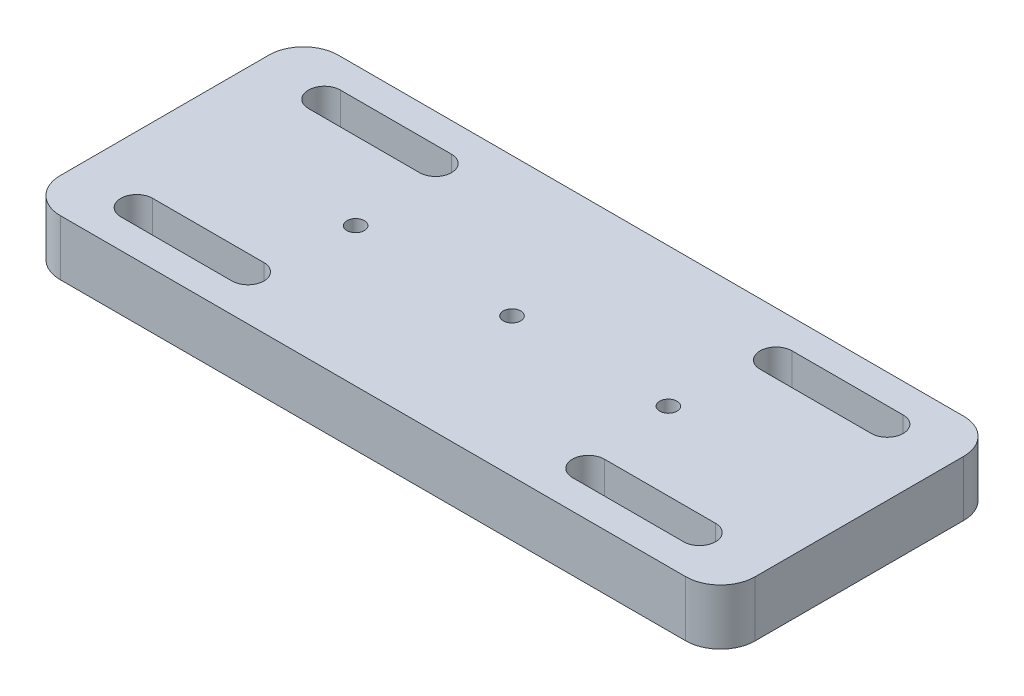
ISO-10303-21;
HEADER;
FILE_DESCRIPTION(('STEP AP214'),'2;1');
FILE_NAME('part.step','',(''),(''),'','','');
FILE_SCHEMA(('AUTOMOTIVE_DESIGN { 1 0 10303 214 1 1 1 1 }'));
ENDSEC;
DATA;
#1=APPLICATION_CONTEXT('core data for automotive mechanical design processes');
#2=APPLICATION_PROTOCOL_DEFINITION('international standard','automotive_design',2000,#1);
#3=PRODUCT_CONTEXT('',#1,'mechanical');
#4=PRODUCT('Part','Part','',(#3));
#5=PRODUCT_RELATED_PRODUCT_CATEGORY('part','',(#4));
#6=PRODUCT_DEFINITION_FORMATION('','',#4);
#7=PRODUCT_DEFINITION_CONTEXT('part definition',#1,'design');
#8=PRODUCT_DEFINITION('design','',#6,#7);
#9=PRODUCT_DEFINITION_SHAPE('','',#8);
#10=(LENGTH_UNIT() NAMED_UNIT(*) SI_UNIT(.MILLI.,.METRE.));
#11=(NAMED_UNIT(*) PLANE_ANGLE_UNIT() SI_UNIT($,.RADIAN.));
#12=(NAMED_UNIT(*) SI_UNIT($,.STERADIAN.) SOLID_ANGLE_UNIT());
#13=UNCERTAINTY_MEASURE_WITH_UNIT(LENGTH_MEASURE(1.E-05),#10,'distance_accuracy_value','');
#14=(GEOMETRIC_REPRESENTATION_CONTEXT(3) GLOBAL_UNCERTAINTY_ASSIGNED_CONTEXT((#13)) GLOBAL_UNIT_ASSIGNED_CONTEXT((#10,
#11,#12)) REPRESENTATION_CONTEXT('',''));
#15=CARTESIAN_POINT('',(0.,0.,0.));
#16=DIRECTION('',(0.,0.,1.));
#17=DIRECTION('',(1.,0.,0.));
#18=AXIS2_PLACEMENT_3D('',#15,#16,#17);
#19=CARTESIAN_POINT('',(0.,8.,0.));
#20=DIRECTION('',(0.,-1.,0.));
#21=DIRECTION('',(0.,0.,-1.));
#22=AXIS2_PLACEMENT_3D('',#19,#20,#21);
#23=PLANE('',#22);
#24=CARTESIAN_POINT('',(-22.5,8.,0.));
#25=DIRECTION('',(0.,1.,0.));
#26=DIRECTION('',(0.,0.,1.));
#27=AXIS2_PLACEMENT_3D('',#24,#25,#26);
#28=CIRCLE('',#27,1.25);
#29=CARTESIAN_POINT('',(-22.5,8.,1.25));
#30=VERTEX_POINT('',#29);
#31=EDGE_CURVE('E430',#30,#30,#28,.T.);
#32=ORIENTED_EDGE('',*,*,#31,.F.);
#33=EDGE_LOOP('',(#32));
#34=FACE_BOUND('',#33,.T.);
#35=CARTESIAN_POINT('',(22.5,8.,0.));
#36=DIRECTION('',(0.,1.,0.));
#37=DIRECTION('',(0.,0.,1.));
#38=AXIS2_PLACEMENT_3D('',#35,#36,#37);
#39=CIRCLE('',#38,1.25);
#40=CARTESIAN_POINT('',(22.5,8.,1.25));
#41=VERTEX_POINT('',#40);
#42=EDGE_CURVE('E425',#41,#41,#39,.T.);
#43=ORIENTED_EDGE('',*,*,#42,.F.);
#44=EDGE_LOOP('',(#43));
#45=FACE_BOUND('',#44,.T.);
#46=CARTESIAN_POINT('',(0.,8.,0.));
#47=DIRECTION('',(0.,1.,0.));
#48=DIRECTION('',(0.,0.,1.));
#49=AXIS2_PLACEMENT_3D('',#46,#47,#48);
#50=CIRCLE('',#49,1.25);
#51=CARTESIAN_POINT('',(0.,8.,1.25));
#52=VERTEX_POINT('',#51);
#53=EDGE_CURVE('E424',#52,#52,#50,.T.);
#54=ORIENTED_EDGE('',*,*,#53,.F.);
#55=EDGE_LOOP('',(#54));
#56=FACE_BOUND('',#55,.T.);
#57=CARTESIAN_POINT('',(40.5,8.,-13.5));
#58=DIRECTION('',(0.,1.,0.));
#59=DIRECTION('',(0.,0.,-1.));
#60=AXIS2_PLACEMENT_3D('',#57,#58,#59);
#61=CIRCLE('',#60,2.3);
#62=CARTESIAN_POINT('',(40.5,8.,-11.2));
#63=VERTEX_POINT('',#62);
#64=CARTESIAN_POINT('',(40.5,8.,-15.8));
#65=VERTEX_POINT('',#64);
#66=EDGE_CURVE('E263',#63,#65,#61,.T.);
#67=ORIENTED_EDGE('',*,*,#66,.F.);
#68=DIRECTION('',(1.,0.,0.));
#69=VECTOR('',#68,1.);
#70=CARTESIAN_POINT('',(40.5,8.,-11.2));
#71=LINE('',#70,#69);
#72=CARTESIAN_POINT('',(24.5,8.,-11.2));
#73=VERTEX_POINT('',#72);
#74=EDGE_CURVE('E274',#73,#63,#71,.T.);
#75=ORIENTED_EDGE('',*,*,#74,.F.);
#76=CARTESIAN_POINT('',(24.5,8.,-13.5));
#77=DIRECTION('',(0.,1.,0.));
#78=DIRECTION('',(0.,0.,-1.));
#79=AXIS2_PLACEMENT_3D('',#76,#77,#78);
#80=CIRCLE('',#79,2.3);
#81=CARTESIAN_POINT('',(24.5,8.,-15.8));
#82=VERTEX_POINT('',#81);
#83=EDGE_CURVE('E270',#82,#73,#80,.T.);
#84=ORIENTED_EDGE('',*,*,#83,.F.);
#85=DIRECTION('',(-1.,0.,0.));
#86=VECTOR('',#85,1.);
#87=CARTESIAN_POINT('',(40.5,8.,-15.8));
#88=LINE('',#87,#86);
#89=EDGE_CURVE('E266',#65,#82,#88,.T.);
#90=ORIENTED_EDGE('',*,*,#89,.F.);
#91=EDGE_LOOP('',(#67,#75,#84,#90));
#92=FACE_BOUND('',#91,.T.);
#93=CARTESIAN_POINT('',(-40.5,8.,-13.5));
#94=DIRECTION('',(0.,1.,0.));
#95=DIRECTION('',(0.,0.,1.));
#96=AXIS2_PLACEMENT_3D('',#93,#94,#95);
#97=CIRCLE('',#96,2.3);
#98=CARTESIAN_POINT('',(-40.5,8.,-15.8));
#99=VERTEX_POINT('',#98);
#100=CARTESIAN_POINT('',(-40.5,8.,-11.2));
#101=VERTEX_POINT('',#100);
#102=EDGE_CURVE('E348',#99,#101,#97,.T.);
#103=ORIENTED_EDGE('',*,*,#102,.F.);
#104=DIRECTION('',(-1.,0.,0.));
#105=VECTOR('',#104,1.);
#106=CARTESIAN_POINT('',(-40.5,8.,-15.8));
#107=LINE('',#106,#105);
#108=CARTESIAN_POINT('',(-24.5,8.,-15.8));
#109=VERTEX_POINT('',#108);
#110=EDGE_CURVE('E359',#109,#99,#107,.T.);
#111=ORIENTED_EDGE('',*,*,#110,.F.);
#112=CARTESIAN_POINT('',(-24.5,8.,-13.5));
#113=DIRECTION('',(0.,1.,0.));
#114=DIRECTION('',(0.,0.,1.));
#115=AXIS2_PLACEMENT_3D('',#112,#113,#114);
#116=CIRCLE('',#115,2.3);
#117=CARTESIAN_POINT('',(-24.5,8.,-11.2));
#118=VERTEX_POINT('',#117);
#119=EDGE_CURVE('E355',#118,#109,#116,.T.);
#120=ORIENTED_EDGE('',*,*,#119,.F.);
#121=DIRECTION('',(1.,0.,0.));
#122=VECTOR('',#121,1.);
#123=CARTESIAN_POINT('',(-40.5,8.,-11.2));
#124=LINE('',#123,#122);
#125=EDGE_CURVE('E351',#101,#118,#124,.T.);
#126=ORIENTED_EDGE('',*,*,#125,.F.);
#127=EDGE_LOOP('',(#103,#111,#120,#126));
#128=FACE_BOUND('',#127,.T.);
#129=DIRECTION('',(1.,0.,0.));
#130=VECTOR('',#129,1.);
#131=CARTESIAN_POINT('',(-50.,8.,20.));
#132=LINE('',#131,#130);
#133=CARTESIAN_POINT('',(-45.,8.,20.));
#134=VERTEX_POINT('',#133);
#135=CARTESIAN_POINT('',(45.,8.,20.));
#136=VERTEX_POINT('',#135);
#137=EDGE_CURVE('E402',#134,#136,#132,.T.);
#138=ORIENTED_EDGE('',*,*,#137,.T.);
#139=CARTESIAN_POINT('',(45.,8.,15.));
#140=DIRECTION('',(0.,-1.,0.));
#141=DIRECTION('',(0.,0.,-1.));
#142=AXIS2_PLACEMENT_3D('',#139,#140,#141);
#143=CIRCLE('',#142,5.);
#144=CARTESIAN_POINT('',(50.,8.,15.));
#145=VERTEX_POINT('',#144);
#146=EDGE_CURVE('E463',#136,#145,#143,.F.);
#147=ORIENTED_EDGE('',*,*,#146,.T.);
#148=DIRECTION('',(0.,0.,-1.));
#149=VECTOR('',#148,1.);
#150=CARTESIAN_POINT('',(50.,8.,20.));
#151=LINE('',#150,#149);
#152=CARTESIAN_POINT('',(50.,8.,-15.));
#153=VERTEX_POINT('',#152);
#154=EDGE_CURVE('E391',#145,#153,#151,.T.);
#155=ORIENTED_EDGE('',*,*,#154,.T.);
#156=CARTESIAN_POINT('',(45.,8.,-15.));
#157=DIRECTION('',(0.,-1.,0.));
#158=DIRECTION('',(0.,0.,-1.));
#159=AXIS2_PLACEMENT_3D('',#156,#157,#158);
#160=CIRCLE('',#159,5.);
#161=CARTESIAN_POINT('',(45.,8.,-20.));
#162=VERTEX_POINT('',#161);
#163=EDGE_CURVE('E458',#153,#162,#160,.F.);
#164=ORIENTED_EDGE('',*,*,#163,.T.);
#165=DIRECTION('',(-1.,0.,0.));
#166=VECTOR('',#165,1.);
#167=CARTESIAN_POINT('',(-50.,8.,-20.));
#168=LINE('',#167,#166);
#169=CARTESIAN_POINT('',(-45.,8.,-20.));
#170=VERTEX_POINT('',#169);
#171=EDGE_CURVE('E395',#162,#170,#168,.T.);
#172=ORIENTED_EDGE('',*,*,#171,.T.);
#173=CARTESIAN_POINT('',(-45.,8.,-15.));
#174=DIRECTION('',(0.,-1.,0.));
#175=DIRECTION('',(0.,0.,-1.));
#176=AXIS2_PLACEMENT_3D('',#173,#174,#175);
#177=CIRCLE('',#176,5.);
#178=CARTESIAN_POINT('',(-50.,8.,-15.));
#179=VERTEX_POINT('',#178);
#180=EDGE_CURVE('E65',#170,#179,#177,.F.);
#181=ORIENTED_EDGE('',*,*,#180,.T.);
#182=DIRECTION('',(0.,0.,1.));
#183=VECTOR('',#182,1.);
#184=CARTESIAN_POINT('',(-50.,8.,20.));
#185=LINE('',#184,#183);
#186=CARTESIAN_POINT('',(-50.,8.,15.));
#187=VERTEX_POINT('',#186);
#188=EDGE_CURVE('E399',#179,#187,#185,.T.);
#189=ORIENTED_EDGE('',*,*,#188,.T.);
#190=CARTESIAN_POINT('',(-45.,8.,15.));
#191=DIRECTION('',(0.,-1.,0.));
#192=DIRECTION('',(0.,0.,-1.));
#193=AXIS2_PLACEMENT_3D('',#190,#191,#192);
#194=CIRCLE('',#193,5.);
#195=EDGE_CURVE('E455',#187,#134,#194,.F.);
#196=ORIENTED_EDGE('',*,*,#195,.T.);
#197=EDGE_LOOP('',(#138,#147,#155,#164,#172,#181,#189,#196));
#198=FACE_BOUND('',#197,.T.);
#199=CARTESIAN_POINT('',(-40.5,8.,13.5));
#200=DIRECTION('',(0.,1.,0.));
#201=DIRECTION('',(0.,0.,1.));
#202=AXIS2_PLACEMENT_3D('',#199,#200,#201);
#203=CIRCLE('',#202,2.3);
#204=CARTESIAN_POINT('',(-40.5,8.,11.2));
#205=VERTEX_POINT('',#204);
#206=CARTESIAN_POINT('',(-40.5,8.,15.8));
#207=VERTEX_POINT('',#206);
#208=EDGE_CURVE('E306',#205,#207,#203,.T.);
#209=ORIENTED_EDGE('',*,*,#208,.F.);
#210=DIRECTION('',(-1.,0.,0.));
#211=VECTOR('',#210,1.);
#212=CARTESIAN_POINT('',(-40.5,8.,11.2));
#213=LINE('',#212,#211);
#214=CARTESIAN_POINT('',(-24.5,8.,11.2));
#215=VERTEX_POINT('',#214);
#216=EDGE_CURVE('E316',#215,#205,#213,.T.);
#217=ORIENTED_EDGE('',*,*,#216,.F.);
#218=CARTESIAN_POINT('',(-24.5,8.,13.5));
#219=DIRECTION('',(0.,1.,0.));
#220=DIRECTION('',(0.,0.,1.));
#221=AXIS2_PLACEMENT_3D('',#218,#219,#220);
#222=CIRCLE('',#221,2.3);
#223=CARTESIAN_POINT('',(-24.5,8.,15.8));
#224=VERTEX_POINT('',#223);
#225=EDGE_CURVE('E312',#224,#215,#222,.T.);
#226=ORIENTED_EDGE('',*,*,#225,.F.);
#227=DIRECTION('',(1.,0.,0.));
#228=VECTOR('',#227,1.);
#229=CARTESIAN_POINT('',(-40.5,8.,15.8));
#230=LINE('',#229,#228);
#231=EDGE_CURVE('E308',#207,#224,#230,.T.);
#232=ORIENTED_EDGE('',*,*,#231,.F.);
#233=EDGE_LOOP('',(#209,#217,#226,#232));
#234=FACE_BOUND('',#233,.T.);
#235=CARTESIAN_POINT('',(40.5,8.,13.5));
#236=DIRECTION('',(0.,1.,0.));
#237=DIRECTION('',(0.,0.,-1.));
#238=AXIS2_PLACEMENT_3D('',#235,#236,#237);
#239=CIRCLE('',#238,2.3);
#240=CARTESIAN_POINT('',(40.5,8.,15.8));
#241=VERTEX_POINT('',#240);
#242=CARTESIAN_POINT('',(40.5,8.,11.2));
#243=VERTEX_POINT('',#242);
#244=EDGE_CURVE('E206',#241,#243,#239,.T.);
#245=ORIENTED_EDGE('',*,*,#244,.F.);
#246=DIRECTION('',(1.,0.,0.));
#247=VECTOR('',#246,1.);
#248=CARTESIAN_POINT('',(40.5,8.,15.8));
#249=LINE('',#248,#247);
#250=CARTESIAN_POINT('',(24.5,8.,15.8));
#251=VERTEX_POINT('',#250);
#252=EDGE_CURVE('E237',#251,#241,#249,.T.);
#253=ORIENTED_EDGE('',*,*,#252,.F.);
#254=CARTESIAN_POINT('',(24.5,8.,13.5));
#255=DIRECTION('',(0.,1.,0.));
#256=DIRECTION('',(0.,0.,-1.));
#257=AXIS2_PLACEMENT_3D('',#254,#255,#256);
#258=CIRCLE('',#257,2.3);
#259=CARTESIAN_POINT('',(24.5,8.,11.2));
#260=VERTEX_POINT('',#259);
#261=EDGE_CURVE('E231',#260,#251,#258,.T.);
#262=ORIENTED_EDGE('',*,*,#261,.F.);
#263=DIRECTION('',(-1.,0.,0.));
#264=VECTOR('',#263,1.);
#265=CARTESIAN_POINT('',(40.5,8.,11.2));
#266=LINE('',#265,#264);
#267=EDGE_CURVE('E217',#243,#260,#266,.T.);
#268=ORIENTED_EDGE('',*,*,#267,.F.);
#269=EDGE_LOOP('',(#245,#253,#262,#268));
#270=FACE_BOUND('',#269,.T.);
#271=ADVANCED_FACE('F42',(#34,#45,#56,#92,#128,#198,#234,#270),#23,.F.);
#272=CARTESIAN_POINT('',(0.,0.,0.));
#273=DIRECTION('',(0.,-1.,0.));
#274=DIRECTION('',(0.,0.,-1.));
#275=AXIS2_PLACEMENT_3D('',#272,#273,#274);
#276=PLANE('',#275);
#277=CARTESIAN_POINT('',(-22.5,0.,0.));
#278=DIRECTION('',(0.,-1.,0.));
#279=DIRECTION('',(0.,0.,-1.));
#280=AXIS2_PLACEMENT_3D('',#277,#278,#279);
#281=CIRCLE('',#280,1.25);
#282=CARTESIAN_POINT('',(-22.5,0.,-1.25));
#283=VERTEX_POINT('',#282);
#284=EDGE_CURVE('E426',#283,#283,#281,.T.);
#285=ORIENTED_EDGE('',*,*,#284,.F.);
#286=EDGE_LOOP('',(#285));
#287=FACE_BOUND('',#286,.T.);
#288=CARTESIAN_POINT('',(22.5,0.,0.));
#289=DIRECTION('',(0.,-1.,0.));
#290=DIRECTION('',(0.,0.,-1.));
#291=AXIS2_PLACEMENT_3D('',#288,#289,#290);
#292=CIRCLE('',#291,1.25);
#293=CARTESIAN_POINT('',(22.5,0.,-1.25));
#294=VERTEX_POINT('',#293);
#295=EDGE_CURVE('E420',#294,#294,#292,.T.);
#296=ORIENTED_EDGE('',*,*,#295,.F.);
#297=EDGE_LOOP('',(#296));
#298=FACE_BOUND('',#297,.T.);
#299=CARTESIAN_POINT('',(0.,0.,0.));
#300=DIRECTION('',(0.,-1.,0.));
#301=DIRECTION('',(0.,0.,-1.));
#302=AXIS2_PLACEMENT_3D('',#299,#300,#301);
#303=CIRCLE('',#302,1.25);
#304=CARTESIAN_POINT('',(0.,0.,-1.25));
#305=VERTEX_POINT('',#304);
#306=EDGE_CURVE('E246',#305,#305,#303,.T.);
#307=ORIENTED_EDGE('',*,*,#306,.F.);
#308=EDGE_LOOP('',(#307));
#309=FACE_BOUND('',#308,.T.);
#310=DIRECTION('',(0.,0.,-1.));
#311=VECTOR('',#310,1.);
#312=CARTESIAN_POINT('',(50.,0.,20.));
#313=LINE('',#312,#311);
#314=CARTESIAN_POINT('',(50.,0.,15.));
#315=VERTEX_POINT('',#314);
#316=CARTESIAN_POINT('',(50.,0.,-15.));
#317=VERTEX_POINT('',#316);
#318=EDGE_CURVE('E390',#315,#317,#313,.T.);
#319=ORIENTED_EDGE('',*,*,#318,.F.);
#320=CARTESIAN_POINT('',(45.,0.,15.));
#321=DIRECTION('',(0.,-1.,0.));
#322=DIRECTION('',(0.,0.,-1.));
#323=AXIS2_PLACEMENT_3D('',#320,#321,#322);
#324=CIRCLE('',#323,5.);
#325=CARTESIAN_POINT('',(45.,0.,20.));
#326=VERTEX_POINT('',#325);
#327=EDGE_CURVE('E445',#315,#326,#324,.T.);
#328=ORIENTED_EDGE('',*,*,#327,.T.);
#329=DIRECTION('',(1.,0.,0.));
#330=VECTOR('',#329,1.);
#331=CARTESIAN_POINT('',(-50.,0.,20.));
#332=LINE('',#331,#330);
#333=CARTESIAN_POINT('',(-45.,0.,20.));
#334=VERTEX_POINT('',#333);
#335=EDGE_CURVE('E396',#334,#326,#332,.T.);
#336=ORIENTED_EDGE('',*,*,#335,.F.);
#337=CARTESIAN_POINT('',(-45.,0.,15.));
#338=DIRECTION('',(0.,-1.,0.));
#339=DIRECTION('',(0.,0.,-1.));
#340=AXIS2_PLACEMENT_3D('',#337,#338,#339);
#341=CIRCLE('',#340,5.);
#342=CARTESIAN_POINT('',(-50.,0.,15.));
#343=VERTEX_POINT('',#342);
#344=EDGE_CURVE('E437',#334,#343,#341,.T.);
#345=ORIENTED_EDGE('',*,*,#344,.T.);
#346=DIRECTION('',(0.,0.,1.));
#347=VECTOR('',#346,1.);
#348=CARTESIAN_POINT('',(-50.,0.,20.));
#349=LINE('',#348,#347);
#350=CARTESIAN_POINT('',(-50.,0.,-15.));
#351=VERTEX_POINT('',#350);
#352=EDGE_CURVE('E414',#351,#343,#349,.T.);
#353=ORIENTED_EDGE('',*,*,#352,.F.);
#354=CARTESIAN_POINT('',(-45.,0.,-15.));
#355=DIRECTION('',(0.,-1.,0.));
#356=DIRECTION('',(0.,0.,-1.));
#357=AXIS2_PLACEMENT_3D('',#354,#355,#356);
#358=CIRCLE('',#357,5.);
#359=CARTESIAN_POINT('',(-45.,0.,-20.));
#360=VERTEX_POINT('',#359);
#361=EDGE_CURVE('E442',#351,#360,#358,.T.);
#362=ORIENTED_EDGE('',*,*,#361,.T.);
#363=DIRECTION('',(-1.,0.,0.));
#364=VECTOR('',#363,1.);
#365=CARTESIAN_POINT('',(-50.,0.,-20.));
#366=LINE('',#365,#364);
#367=CARTESIAN_POINT('',(45.,0.,-20.));
#368=VERTEX_POINT('',#367);
#369=EDGE_CURVE('E410',#368,#360,#366,.T.);
#370=ORIENTED_EDGE('',*,*,#369,.F.);
#371=CARTESIAN_POINT('',(45.,0.,-15.));
#372=DIRECTION('',(0.,-1.,0.));
#373=DIRECTION('',(0.,0.,-1.));
#374=AXIS2_PLACEMENT_3D('',#371,#372,#373);
#375=CIRCLE('',#374,5.);
#376=EDGE_CURVE('E440',#368,#317,#375,.T.);
#377=ORIENTED_EDGE('',*,*,#376,.T.);
#378=EDGE_LOOP('',(#319,#328,#336,#345,#353,#362,#370,#377));
#379=FACE_BOUND('',#378,.T.);
#380=DIRECTION('',(-1.,0.,0.));
#381=VECTOR('',#380,1.);
#382=CARTESIAN_POINT('',(-40.5,0.,-15.8));
#383=LINE('',#382,#381);
#384=CARTESIAN_POINT('',(-24.5,0.,-15.8));
#385=VERTEX_POINT('',#384);
#386=CARTESIAN_POINT('',(-40.5,0.,-15.8));
#387=VERTEX_POINT('',#386);
#388=EDGE_CURVE('E352',#385,#387,#383,.T.);
#389=ORIENTED_EDGE('',*,*,#388,.T.);
#390=CARTESIAN_POINT('',(-40.5,0.,-13.5));
#391=DIRECTION('',(0.,1.,0.));
#392=DIRECTION('',(0.,0.,1.));
#393=AXIS2_PLACEMENT_3D('',#390,#391,#392);
#394=CIRCLE('',#393,2.3);
#395=CARTESIAN_POINT('',(-40.5,0.,-11.2));
#396=VERTEX_POINT('',#395);
#397=EDGE_CURVE('E347',#387,#396,#394,.T.);
#398=ORIENTED_EDGE('',*,*,#397,.T.);
#399=DIRECTION('',(1.,0.,0.));
#400=VECTOR('',#399,1.);
#401=CARTESIAN_POINT('',(-40.5,0.,-11.2));
#402=LINE('',#401,#400);
#403=CARTESIAN_POINT('',(-24.5,0.,-11.2));
#404=VERTEX_POINT('',#403);
#405=EDGE_CURVE('E366',#396,#404,#402,.T.);
#406=ORIENTED_EDGE('',*,*,#405,.T.);
#407=CARTESIAN_POINT('',(-24.5,0.,-13.5));
#408=DIRECTION('',(0.,1.,0.));
#409=DIRECTION('',(0.,0.,1.));
#410=AXIS2_PLACEMENT_3D('',#407,#408,#409);
#411=CIRCLE('',#410,2.3);
#412=EDGE_CURVE('E370',#404,#385,#411,.T.);
#413=ORIENTED_EDGE('',*,*,#412,.T.);
#414=EDGE_LOOP('',(#389,#398,#406,#413));
#415=FACE_BOUND('',#414,.T.);
#416=DIRECTION('',(-1.,0.,0.));
#417=VECTOR('',#416,1.);
#418=CARTESIAN_POINT('',(-40.5,0.,11.2));
#419=LINE('',#418,#417);
#420=CARTESIAN_POINT('',(-24.5,0.,11.2));
#421=VERTEX_POINT('',#420);
#422=CARTESIAN_POINT('',(-40.5,0.,11.2));
#423=VERTEX_POINT('',#422);
#424=EDGE_CURVE('E309',#421,#423,#419,.T.);
#425=ORIENTED_EDGE('',*,*,#424,.T.);
#426=CARTESIAN_POINT('',(-40.5,0.,13.5));
#427=DIRECTION('',(0.,1.,0.));
#428=DIRECTION('',(0.,0.,1.));
#429=AXIS2_PLACEMENT_3D('',#426,#427,#428);
#430=CIRCLE('',#429,2.3);
#431=CARTESIAN_POINT('',(-40.5,0.,15.8));
#432=VERTEX_POINT('',#431);
#433=EDGE_CURVE('E305',#423,#432,#430,.T.);
#434=ORIENTED_EDGE('',*,*,#433,.T.);
#435=DIRECTION('',(1.,0.,0.));
#436=VECTOR('',#435,1.);
#437=CARTESIAN_POINT('',(-40.5,0.,15.8));
#438=LINE('',#437,#436);
#439=CARTESIAN_POINT('',(-24.5,0.,15.8));
#440=VERTEX_POINT('',#439);
#441=EDGE_CURVE('E323',#432,#440,#438,.T.);
#442=ORIENTED_EDGE('',*,*,#441,.T.);
#443=CARTESIAN_POINT('',(-24.5,0.,13.5));
#444=DIRECTION('',(0.,1.,0.));
#445=DIRECTION('',(0.,0.,1.));
#446=AXIS2_PLACEMENT_3D('',#443,#444,#445);
#447=CIRCLE('',#446,2.3);
#448=EDGE_CURVE('E327',#440,#421,#447,.T.);
#449=ORIENTED_EDGE('',*,*,#448,.T.);
#450=EDGE_LOOP('',(#425,#434,#442,#449));
#451=FACE_BOUND('',#450,.T.);
#452=DIRECTION('',(1.,0.,0.));
#453=VECTOR('',#452,1.);
#454=CARTESIAN_POINT('',(40.5,0.,-11.2));
#455=LINE('',#454,#453);
#456=CARTESIAN_POINT('',(24.5,0.,-11.2));
#457=VERTEX_POINT('',#456);
#458=CARTESIAN_POINT('',(40.5,0.,-11.2));
#459=VERTEX_POINT('',#458);
#460=EDGE_CURVE('E267',#457,#459,#455,.T.);
#461=ORIENTED_EDGE('',*,*,#460,.T.);
#462=CARTESIAN_POINT('',(40.5,0.,-13.5));
#463=DIRECTION('',(0.,1.,0.));
#464=DIRECTION('',(0.,0.,-1.));
#465=AXIS2_PLACEMENT_3D('',#462,#463,#464);
#466=CIRCLE('',#465,2.3);
#467=CARTESIAN_POINT('',(40.5,0.,-15.8));
#468=VERTEX_POINT('',#467);
#469=EDGE_CURVE('E226',#459,#468,#466,.T.);
#470=ORIENTED_EDGE('',*,*,#469,.T.);
#471=DIRECTION('',(-1.,0.,0.));
#472=VECTOR('',#471,1.);
#473=CARTESIAN_POINT('',(40.5,0.,-15.8));
#474=LINE('',#473,#472);
#475=CARTESIAN_POINT('',(24.5,0.,-15.8));
#476=VERTEX_POINT('',#475);
#477=EDGE_CURVE('E281',#468,#476,#474,.T.);
#478=ORIENTED_EDGE('',*,*,#477,.T.);
#479=CARTESIAN_POINT('',(24.5,0.,-13.5));
#480=DIRECTION('',(0.,1.,0.));
#481=DIRECTION('',(0.,0.,-1.));
#482=AXIS2_PLACEMENT_3D('',#479,#480,#481);
#483=CIRCLE('',#482,2.3);
#484=EDGE_CURVE('E285',#476,#457,#483,.T.);
#485=ORIENTED_EDGE('',*,*,#484,.T.);
#486=EDGE_LOOP('',(#461,#470,#478,#485));
#487=FACE_BOUND('',#486,.T.);
#488=DIRECTION('',(1.,0.,0.));
#489=VECTOR('',#488,1.);
#490=CARTESIAN_POINT('',(40.5,0.,15.8));
#491=LINE('',#490,#489);
#492=CARTESIAN_POINT('',(24.5,0.,15.8));
#493=VERTEX_POINT('',#492);
#494=CARTESIAN_POINT('',(40.5,0.,15.8));
#495=VERTEX_POINT('',#494);
#496=EDGE_CURVE('E218',#493,#495,#491,.T.);
#497=ORIENTED_EDGE('',*,*,#496,.T.);
#498=CARTESIAN_POINT('',(40.5,0.,13.5));
#499=DIRECTION('',(0.,1.,0.));
#500=DIRECTION('',(0.,0.,-1.));
#501=AXIS2_PLACEMENT_3D('',#498,#499,#500);
#502=CIRCLE('',#501,2.3);
#503=CARTESIAN_POINT('',(40.5,0.,11.2));
#504=VERTEX_POINT('',#503);
#505=EDGE_CURVE('E243',#495,#504,#502,.T.);
#506=ORIENTED_EDGE('',*,*,#505,.T.);
#507=DIRECTION('',(-1.,0.,0.));
#508=VECTOR('',#507,1.);
#509=CARTESIAN_POINT('',(40.5,0.,11.2));
#510=LINE('',#509,#508);
#511=CARTESIAN_POINT('',(24.5,0.,11.2));
#512=VERTEX_POINT('',#511);
#513=EDGE_CURVE('E224',#504,#512,#510,.T.);
#514=ORIENTED_EDGE('',*,*,#513,.T.);
#515=CARTESIAN_POINT('',(24.5,0.,13.5));
#516=DIRECTION('',(0.,1.,0.));
#517=DIRECTION('',(0.,0.,-1.));
#518=AXIS2_PLACEMENT_3D('',#515,#516,#517);
#519=CIRCLE('',#518,2.3);
#520=EDGE_CURVE('E249',#512,#493,#519,.T.);
#521=ORIENTED_EDGE('',*,*,#520,.T.);
#522=EDGE_LOOP('',(#497,#506,#514,#521));
#523=FACE_BOUND('',#522,.T.);
#524=ADVANCED_FACE('F483',(#287,#298,#309,#379,#415,#451,#487,#523),#276,.T.);
#525=CARTESIAN_POINT('',(50.,8.,20.));
#526=DIRECTION('',(-1.,0.,0.));
#527=DIRECTION('',(0.,0.,1.));
#528=AXIS2_PLACEMENT_3D('',#525,#526,#527);
#529=PLANE('',#528);
#530=ORIENTED_EDGE('',*,*,#154,.F.);
#531=DIRECTION('',(0.,-1.,0.));
#532=VECTOR('',#531,1.);
#533=CARTESIAN_POINT('',(50.,8.,15.));
#534=LINE('',#533,#532);
#535=EDGE_CURVE('E433',#145,#315,#534,.T.);
#536=ORIENTED_EDGE('',*,*,#535,.T.);
#537=ORIENTED_EDGE('',*,*,#318,.T.);
#538=DIRECTION('',(0.,-1.,0.));
#539=VECTOR('',#538,1.);
#540=CARTESIAN_POINT('',(50.,8.,-15.));
#541=LINE('',#540,#539);
#542=EDGE_CURVE('E406',#317,#153,#541,.F.);
#543=ORIENTED_EDGE('',*,*,#542,.T.);
#544=EDGE_LOOP('',(#530,#536,#537,#543));
#545=FACE_BOUND('',#544,.T.);
#546=ADVANCED_FACE('F505',(#545),#529,.F.);
#547=CARTESIAN_POINT('',(-50.,8.,-20.));
#548=DIRECTION('',(0.,0.,1.));
#549=DIRECTION('',(1.,0.,0.));
#550=AXIS2_PLACEMENT_3D('',#547,#548,#549);
#551=PLANE('',#550);
#552=ORIENTED_EDGE('',*,*,#369,.T.);
#553=DIRECTION('',(0.,-1.,0.));
#554=VECTOR('',#553,1.);
#555=CARTESIAN_POINT('',(-45.,8.,-20.));
#556=LINE('',#555,#554);
#557=EDGE_CURVE('E11',#360,#170,#556,.F.);
#558=ORIENTED_EDGE('',*,*,#557,.T.);
#559=ORIENTED_EDGE('',*,*,#171,.F.);
#560=DIRECTION('',(0.,-1.,0.));
#561=VECTOR('',#560,1.);
#562=CARTESIAN_POINT('',(45.,8.,-20.));
#563=LINE('',#562,#561);
#564=EDGE_CURVE('E51',#162,#368,#563,.T.);
#565=ORIENTED_EDGE('',*,*,#564,.T.);
#566=EDGE_LOOP('',(#552,#558,#559,#565));
#567=FACE_BOUND('',#566,.T.);
#568=ADVANCED_FACE('F477',(#567),#551,.F.);
#569=CARTESIAN_POINT('',(-50.,8.,20.));
#570=DIRECTION('',(1.,0.,0.));
#571=DIRECTION('',(0.,0.,-1.));
#572=AXIS2_PLACEMENT_3D('',#569,#570,#571);
#573=PLANE('',#572);
#574=ORIENTED_EDGE('',*,*,#188,.F.);
#575=DIRECTION('',(0.,-1.,0.));
#576=VECTOR('',#575,1.);
#577=CARTESIAN_POINT('',(-50.,8.,-15.));
#578=LINE('',#577,#576);
#579=EDGE_CURVE('E468',#179,#351,#578,.T.);
#580=ORIENTED_EDGE('',*,*,#579,.T.);
#581=ORIENTED_EDGE('',*,*,#352,.T.);
#582=DIRECTION('',(0.,-1.,0.));
#583=VECTOR('',#582,1.);
#584=CARTESIAN_POINT('',(-50.,8.,15.));
#585=LINE('',#584,#583);
#586=EDGE_CURVE('E58',#343,#187,#585,.F.);
#587=ORIENTED_EDGE('',*,*,#586,.T.);
#588=EDGE_LOOP('',(#574,#580,#581,#587));
#589=FACE_BOUND('',#588,.T.);
#590=ADVANCED_FACE('F489',(#589),#573,.F.);
#591=CARTESIAN_POINT('',(-50.,8.,20.));
#592=DIRECTION('',(0.,0.,-1.));
#593=DIRECTION('',(-1.,0.,0.));
#594=AXIS2_PLACEMENT_3D('',#591,#592,#593);
#595=PLANE('',#594);
#596=ORIENTED_EDGE('',*,*,#335,.T.);
#597=DIRECTION('',(0.,-1.,0.));
#598=VECTOR('',#597,1.);
#599=CARTESIAN_POINT('',(45.,8.,20.));
#600=LINE('',#599,#598);
#601=EDGE_CURVE('E452',#326,#136,#600,.F.);
#602=ORIENTED_EDGE('',*,*,#601,.T.);
#603=ORIENTED_EDGE('',*,*,#137,.F.);
#604=DIRECTION('',(0.,-1.,0.));
#605=VECTOR('',#604,1.);
#606=CARTESIAN_POINT('',(-45.,8.,20.));
#607=LINE('',#606,#605);
#608=EDGE_CURVE('E448',#134,#334,#607,.T.);
#609=ORIENTED_EDGE('',*,*,#608,.T.);
#610=EDGE_LOOP('',(#596,#602,#603,#609));
#611=FACE_BOUND('',#610,.T.);
#612=ADVANCED_FACE('F497',(#611),#595,.F.);
#613=CARTESIAN_POINT('',(-40.5,8.,-13.5));
#614=DIRECTION('',(0.,-1.,0.));
#615=DIRECTION('',(0.,0.,-1.));
#616=AXIS2_PLACEMENT_3D('',#613,#614,#615);
#617=CYLINDRICAL_SURFACE('',#616,2.3);
#618=ORIENTED_EDGE('',*,*,#397,.F.);
#619=DIRECTION('',(0.,-1.,0.));
#620=VECTOR('',#619,1.);
#621=CARTESIAN_POINT('',(-40.5,8.,-15.8));
#622=LINE('',#621,#620);
#623=EDGE_CURVE('E362',#99,#387,#622,.T.);
#624=ORIENTED_EDGE('',*,*,#623,.F.);
#625=ORIENTED_EDGE('',*,*,#102,.T.);
#626=DIRECTION('',(0.,-1.,0.));
#627=VECTOR('',#626,1.);
#628=CARTESIAN_POINT('',(-40.5,8.,-11.2));
#629=LINE('',#628,#627);
#630=EDGE_CURVE('E386',#101,#396,#629,.T.);
#631=ORIENTED_EDGE('',*,*,#630,.T.);
#632=EDGE_LOOP('',(#618,#624,#625,#631));
#633=FACE_BOUND('',#632,.T.);
#634=ADVANCED_FACE('F525',(#633),#617,.F.);
#635=CARTESIAN_POINT('',(-40.5,8.,-11.2));
#636=DIRECTION('',(0.,0.,-1.));
#637=DIRECTION('',(-1.,0.,0.));
#638=AXIS2_PLACEMENT_3D('',#635,#636,#637);
#639=PLANE('',#638);
#640=ORIENTED_EDGE('',*,*,#405,.F.);
#641=ORIENTED_EDGE('',*,*,#630,.F.);
#642=ORIENTED_EDGE('',*,*,#125,.T.);
#643=DIRECTION('',(0.,-1.,0.));
#644=VECTOR('',#643,1.);
#645=CARTESIAN_POINT('',(-24.5,8.,-11.2));
#646=LINE('',#645,#644);
#647=EDGE_CURVE('E383',#118,#404,#646,.T.);
#648=ORIENTED_EDGE('',*,*,#647,.T.);
#649=EDGE_LOOP('',(#640,#641,#642,#648));
#650=FACE_BOUND('',#649,.T.);
#651=ADVANCED_FACE('F605',(#650),#639,.T.);
#652=CARTESIAN_POINT('',(-24.5,8.,-13.5));
#653=DIRECTION('',(0.,-1.,0.));
#654=DIRECTION('',(0.,0.,-1.));
#655=AXIS2_PLACEMENT_3D('',#652,#653,#654);
#656=CYLINDRICAL_SURFACE('',#655,2.3);
#657=ORIENTED_EDGE('',*,*,#412,.F.);
#658=ORIENTED_EDGE('',*,*,#647,.F.);
#659=ORIENTED_EDGE('',*,*,#119,.T.);
#660=DIRECTION('',(0.,-1.,0.));
#661=VECTOR('',#660,1.);
#662=CARTESIAN_POINT('',(-24.5,8.,-15.8));
#663=LINE('',#662,#661);
#664=EDGE_CURVE('E380',#109,#385,#663,.T.);
#665=ORIENTED_EDGE('',*,*,#664,.T.);
#666=EDGE_LOOP('',(#657,#658,#659,#665));
#667=FACE_BOUND('',#666,.T.);
#668=ADVANCED_FACE('F602',(#667),#656,.F.);
#669=CARTESIAN_POINT('',(-40.5,8.,-15.8));
#670=DIRECTION('',(0.,0.,1.));
#671=DIRECTION('',(1.,0.,0.));
#672=AXIS2_PLACEMENT_3D('',#669,#670,#671);
#673=PLANE('',#672);
#674=ORIENTED_EDGE('',*,*,#388,.F.);
#675=ORIENTED_EDGE('',*,*,#664,.F.);
#676=ORIENTED_EDGE('',*,*,#110,.T.);
#677=ORIENTED_EDGE('',*,*,#623,.T.);
#678=EDGE_LOOP('',(#674,#675,#676,#677));
#679=FACE_BOUND('',#678,.T.);
#680=ADVANCED_FACE('F598',(#679),#673,.T.);
#681=CARTESIAN_POINT('',(-40.5,8.,13.5));
#682=DIRECTION('',(0.,-1.,0.));
#683=DIRECTION('',(0.,0.,-1.));
#684=AXIS2_PLACEMENT_3D('',#681,#682,#683);
#685=CYLINDRICAL_SURFACE('',#684,2.3);
#686=ORIENTED_EDGE('',*,*,#433,.F.);
#687=DIRECTION('',(0.,-1.,0.));
#688=VECTOR('',#687,1.);
#689=CARTESIAN_POINT('',(-40.5,8.,11.2));
#690=LINE('',#689,#688);
#691=EDGE_CURVE('E319',#205,#423,#690,.T.);
#692=ORIENTED_EDGE('',*,*,#691,.F.);
#693=ORIENTED_EDGE('',*,*,#208,.T.);
#694=DIRECTION('',(0.,-1.,0.));
#695=VECTOR('',#694,1.);
#696=CARTESIAN_POINT('',(-40.5,8.,15.8));
#697=LINE('',#696,#695);
#698=EDGE_CURVE('E343',#207,#432,#697,.T.);
#699=ORIENTED_EDGE('',*,*,#698,.T.);
#700=EDGE_LOOP('',(#686,#692,#693,#699));
#701=FACE_BOUND('',#700,.T.);
#702=ADVANCED_FACE('F594',(#701),#685,.F.);
#703=CARTESIAN_POINT('',(-40.5,8.,15.8));
#704=DIRECTION('',(0.,0.,-1.));
#705=DIRECTION('',(-1.,0.,0.));
#706=AXIS2_PLACEMENT_3D('',#703,#704,#705);
#707=PLANE('',#706);
#708=ORIENTED_EDGE('',*,*,#441,.F.);
#709=ORIENTED_EDGE('',*,*,#698,.F.);
#710=ORIENTED_EDGE('',*,*,#231,.T.);
#711=DIRECTION('',(0.,-1.,0.));
#712=VECTOR('',#711,1.);
#713=CARTESIAN_POINT('',(-24.5,8.,15.8));
#714=LINE('',#713,#712);
#715=EDGE_CURVE('E340',#224,#440,#714,.T.);
#716=ORIENTED_EDGE('',*,*,#715,.T.);
#717=EDGE_LOOP('',(#708,#709,#710,#716));
#718=FACE_BOUND('',#717,.T.);
#719=ADVANCED_FACE('F590',(#718),#707,.T.);
#720=CARTESIAN_POINT('',(-24.5,8.,13.5));
#721=DIRECTION('',(0.,-1.,0.));
#722=DIRECTION('',(0.,0.,-1.));
#723=AXIS2_PLACEMENT_3D('',#720,#721,#722);
#724=CYLINDRICAL_SURFACE('',#723,2.3);
#725=ORIENTED_EDGE('',*,*,#448,.F.);
#726=ORIENTED_EDGE('',*,*,#715,.F.);
#727=ORIENTED_EDGE('',*,*,#225,.T.);
#728=DIRECTION('',(0.,-1.,0.));
#729=VECTOR('',#728,1.);
#730=CARTESIAN_POINT('',(-24.5,8.,11.2));
#731=LINE('',#730,#729);
#732=EDGE_CURVE('E337',#215,#421,#731,.T.);
#733=ORIENTED_EDGE('',*,*,#732,.T.);
#734=EDGE_LOOP('',(#725,#726,#727,#733));
#735=FACE_BOUND('',#734,.T.);
#736=ADVANCED_FACE('F586',(#735),#724,.F.);
#737=CARTESIAN_POINT('',(-40.5,8.,11.2));
#738=DIRECTION('',(0.,0.,1.));
#739=DIRECTION('',(1.,0.,0.));
#740=AXIS2_PLACEMENT_3D('',#737,#738,#739);
#741=PLANE('',#740);
#742=ORIENTED_EDGE('',*,*,#424,.F.);
#743=ORIENTED_EDGE('',*,*,#732,.F.);
#744=ORIENTED_EDGE('',*,*,#216,.T.);
#745=ORIENTED_EDGE('',*,*,#691,.T.);
#746=EDGE_LOOP('',(#742,#743,#744,#745));
#747=FACE_BOUND('',#746,.T.);
#748=ADVANCED_FACE('F582',(#747),#741,.T.);
#749=CARTESIAN_POINT('',(40.5,8.,-13.5));
#750=DIRECTION('',(0.,-1.,0.));
#751=DIRECTION('',(0.,0.,-1.));
#752=AXIS2_PLACEMENT_3D('',#749,#750,#751);
#753=CYLINDRICAL_SURFACE('',#752,2.3);
#754=ORIENTED_EDGE('',*,*,#469,.F.);
#755=DIRECTION('',(0.,-1.,0.));
#756=VECTOR('',#755,1.);
#757=CARTESIAN_POINT('',(40.5,8.,-11.2));
#758=LINE('',#757,#756);
#759=EDGE_CURVE('E277',#63,#459,#758,.T.);
#760=ORIENTED_EDGE('',*,*,#759,.F.);
#761=ORIENTED_EDGE('',*,*,#66,.T.);
#762=DIRECTION('',(0.,-1.,0.));
#763=VECTOR('',#762,1.);
#764=CARTESIAN_POINT('',(40.5,8.,-15.8));
#765=LINE('',#764,#763);
#766=EDGE_CURVE('E301',#65,#468,#765,.T.);
#767=ORIENTED_EDGE('',*,*,#766,.T.);
#768=EDGE_LOOP('',(#754,#760,#761,#767));
#769=FACE_BOUND('',#768,.T.);
#770=ADVANCED_FACE('F578',(#769),#753,.F.);
#771=CARTESIAN_POINT('',(40.5,8.,-15.8));
#772=DIRECTION('',(0.,0.,1.));
#773=DIRECTION('',(1.,0.,0.));
#774=AXIS2_PLACEMENT_3D('',#771,#772,#773);
#775=PLANE('',#774);
#776=ORIENTED_EDGE('',*,*,#477,.F.);
#777=ORIENTED_EDGE('',*,*,#766,.F.);
#778=ORIENTED_EDGE('',*,*,#89,.T.);
#779=DIRECTION('',(0.,-1.,0.));
#780=VECTOR('',#779,1.);
#781=CARTESIAN_POINT('',(24.5,8.,-15.8));
#782=LINE('',#781,#780);
#783=EDGE_CURVE('E298',#82,#476,#782,.T.);
#784=ORIENTED_EDGE('',*,*,#783,.T.);
#785=EDGE_LOOP('',(#776,#777,#778,#784));
#786=FACE_BOUND('',#785,.T.);
#787=ADVANCED_FACE('F574',(#786),#775,.T.);
#788=CARTESIAN_POINT('',(24.5,8.,-13.5));
#789=DIRECTION('',(0.,-1.,0.));
#790=DIRECTION('',(0.,0.,-1.));
#791=AXIS2_PLACEMENT_3D('',#788,#789,#790);
#792=CYLINDRICAL_SURFACE('',#791,2.3);
#793=ORIENTED_EDGE('',*,*,#484,.F.);
#794=ORIENTED_EDGE('',*,*,#783,.F.);
#795=ORIENTED_EDGE('',*,*,#83,.T.);
#796=DIRECTION('',(0.,-1.,0.));
#797=VECTOR('',#796,1.);
#798=CARTESIAN_POINT('',(24.5,8.,-11.2));
#799=LINE('',#798,#797);
#800=EDGE_CURVE('E295',#73,#457,#799,.T.);
#801=ORIENTED_EDGE('',*,*,#800,.T.);
#802=EDGE_LOOP('',(#793,#794,#795,#801));
#803=FACE_BOUND('',#802,.T.);
#804=ADVANCED_FACE('F570',(#803),#792,.F.);
#805=CARTESIAN_POINT('',(40.5,8.,-11.2));
#806=DIRECTION('',(0.,0.,-1.));
#807=DIRECTION('',(-1.,0.,0.));
#808=AXIS2_PLACEMENT_3D('',#805,#806,#807);
#809=PLANE('',#808);
#810=ORIENTED_EDGE('',*,*,#460,.F.);
#811=ORIENTED_EDGE('',*,*,#800,.F.);
#812=ORIENTED_EDGE('',*,*,#74,.T.);
#813=ORIENTED_EDGE('',*,*,#759,.T.);
#814=EDGE_LOOP('',(#810,#811,#812,#813));
#815=FACE_BOUND('',#814,.T.);
#816=ADVANCED_FACE('F567',(#815),#809,.T.);
#817=CARTESIAN_POINT('',(40.5,8.,13.5));
#818=DIRECTION('',(0.,-1.,0.));
#819=DIRECTION('',(0.,0.,-1.));
#820=AXIS2_PLACEMENT_3D('',#817,#818,#819);
#821=CYLINDRICAL_SURFACE('',#820,2.3);
#822=ORIENTED_EDGE('',*,*,#505,.F.);
#823=DIRECTION('',(0.,-1.,0.));
#824=VECTOR('',#823,1.);
#825=CARTESIAN_POINT('',(40.5,8.,15.8));
#826=LINE('',#825,#824);
#827=EDGE_CURVE('E212',#241,#495,#826,.T.);
#828=ORIENTED_EDGE('',*,*,#827,.F.);
#829=ORIENTED_EDGE('',*,*,#244,.T.);
#830=DIRECTION('',(0.,-1.,0.));
#831=VECTOR('',#830,1.);
#832=CARTESIAN_POINT('',(40.5,8.,11.2));
#833=LINE('',#832,#831);
#834=EDGE_CURVE('E209',#243,#504,#833,.T.);
#835=ORIENTED_EDGE('',*,*,#834,.T.);
#836=EDGE_LOOP('',(#822,#828,#829,#835));
#837=FACE_BOUND('',#836,.T.);
#838=ADVANCED_FACE('F208',(#837),#821,.F.);
#839=CARTESIAN_POINT('',(40.5,8.,11.2));
#840=DIRECTION('',(0.,0.,1.));
#841=DIRECTION('',(1.,0.,0.));
#842=AXIS2_PLACEMENT_3D('',#839,#840,#841);
#843=PLANE('',#842);
#844=ORIENTED_EDGE('',*,*,#513,.F.);
#845=ORIENTED_EDGE('',*,*,#834,.F.);
#846=ORIENTED_EDGE('',*,*,#267,.T.);
#847=DIRECTION('',(0.,-1.,0.));
#848=VECTOR('',#847,1.);
#849=CARTESIAN_POINT('',(24.5,8.,11.2));
#850=LINE('',#849,#848);
#851=EDGE_CURVE('E227',#260,#512,#850,.T.);
#852=ORIENTED_EDGE('',*,*,#851,.T.);
#853=EDGE_LOOP('',(#844,#845,#846,#852));
#854=FACE_BOUND('',#853,.T.);
#855=ADVANCED_FACE('F221',(#854),#843,.T.);
#856=CARTESIAN_POINT('',(24.5,8.,13.5));
#857=DIRECTION('',(0.,-1.,0.));
#858=DIRECTION('',(0.,0.,-1.));
#859=AXIS2_PLACEMENT_3D('',#856,#857,#858);
#860=CYLINDRICAL_SURFACE('',#859,2.3);
#861=ORIENTED_EDGE('',*,*,#520,.F.);
#862=ORIENTED_EDGE('',*,*,#851,.F.);
#863=ORIENTED_EDGE('',*,*,#261,.T.);
#864=DIRECTION('',(0.,-1.,0.));
#865=VECTOR('',#864,1.);
#866=CARTESIAN_POINT('',(24.5,8.,15.8));
#867=LINE('',#866,#865);
#868=EDGE_CURVE('E258',#251,#493,#867,.T.);
#869=ORIENTED_EDGE('',*,*,#868,.T.);
#870=EDGE_LOOP('',(#861,#862,#863,#869));
#871=FACE_BOUND('',#870,.T.);
#872=ADVANCED_FACE('F558',(#871),#860,.F.);
#873=CARTESIAN_POINT('',(40.5,8.,15.8));
#874=DIRECTION('',(0.,0.,-1.));
#875=DIRECTION('',(-1.,0.,0.));
#876=AXIS2_PLACEMENT_3D('',#873,#874,#875);
#877=PLANE('',#876);
#878=ORIENTED_EDGE('',*,*,#496,.F.);
#879=ORIENTED_EDGE('',*,*,#868,.F.);
#880=ORIENTED_EDGE('',*,*,#252,.T.);
#881=ORIENTED_EDGE('',*,*,#827,.T.);
#882=EDGE_LOOP('',(#878,#879,#880,#881));
#883=FACE_BOUND('',#882,.T.);
#884=ADVANCED_FACE('F554',(#883),#877,.T.);
#885=CARTESIAN_POINT('',(0.,8.,0.));
#886=DIRECTION('',(0.,1.,0.));
#887=DIRECTION('',(0.,0.,1.));
#888=AXIS2_PLACEMENT_3D('',#885,#886,#887);
#889=CYLINDRICAL_SURFACE('',#888,1.25);
#890=ORIENTED_EDGE('',*,*,#306,.T.);
#891=EDGE_LOOP('',(#890));
#892=FACE_BOUND('',#891,.T.);
#893=ORIENTED_EDGE('',*,*,#53,.T.);
#894=EDGE_LOOP('',(#893));
#895=FACE_BOUND('',#894,.T.);
#896=ADVANCED_FACE('F547',(#892,#895),#889,.F.);
#897=CARTESIAN_POINT('',(22.5,8.,0.));
#898=DIRECTION('',(0.,1.,0.));
#899=DIRECTION('',(0.,0.,1.));
#900=AXIS2_PLACEMENT_3D('',#897,#898,#899);
#901=CYLINDRICAL_SURFACE('',#900,1.25);
#902=ORIENTED_EDGE('',*,*,#295,.T.);
#903=EDGE_LOOP('',(#902));
#904=FACE_BOUND('',#903,.T.);
#905=ORIENTED_EDGE('',*,*,#42,.T.);
#906=EDGE_LOOP('',(#905));
#907=FACE_BOUND('',#906,.T.);
#908=ADVANCED_FACE('F541',(#904,#907),#901,.F.);
#909=CARTESIAN_POINT('',(-22.5,8.,0.));
#910=DIRECTION('',(0.,1.,0.));
#911=DIRECTION('',(0.,0.,1.));
#912=AXIS2_PLACEMENT_3D('',#909,#910,#911);
#913=CYLINDRICAL_SURFACE('',#912,1.25);
#914=ORIENTED_EDGE('',*,*,#284,.T.);
#915=EDGE_LOOP('',(#914));
#916=FACE_BOUND('',#915,.T.);
#917=ORIENTED_EDGE('',*,*,#31,.T.);
#918=EDGE_LOOP('',(#917));
#919=FACE_BOUND('',#918,.T.);
#920=ADVANCED_FACE('F537',(#916,#919),#913,.F.);
#921=CARTESIAN_POINT('',(45.,8.,15.));
#922=DIRECTION('',(0.,-1.,0.));
#923=DIRECTION('',(0.,0.,-1.));
#924=AXIS2_PLACEMENT_3D('',#921,#922,#923);
#925=CYLINDRICAL_SURFACE('',#924,5.);
#926=ORIENTED_EDGE('',*,*,#146,.F.);
#927=ORIENTED_EDGE('',*,*,#601,.F.);
#928=ORIENTED_EDGE('',*,*,#327,.F.);
#929=ORIENTED_EDGE('',*,*,#535,.F.);
#930=EDGE_LOOP('',(#926,#927,#928,#929));
#931=FACE_BOUND('',#930,.T.);
#932=ADVANCED_FACE('F502',(#931),#925,.T.);
#933=CARTESIAN_POINT('',(-45.,8.,-15.));
#934=DIRECTION('',(0.,-1.,0.));
#935=DIRECTION('',(0.,0.,-1.));
#936=AXIS2_PLACEMENT_3D('',#933,#934,#935);
#937=CYLINDRICAL_SURFACE('',#936,5.);
#938=ORIENTED_EDGE('',*,*,#180,.F.);
#939=ORIENTED_EDGE('',*,*,#557,.F.);
#940=ORIENTED_EDGE('',*,*,#361,.F.);
#941=ORIENTED_EDGE('',*,*,#579,.F.);
#942=EDGE_LOOP('',(#938,#939,#940,#941));
#943=FACE_BOUND('',#942,.T.);
#944=ADVANCED_FACE('F488',(#943),#937,.T.);
#945=CARTESIAN_POINT('',(45.,8.,-15.));
#946=DIRECTION('',(0.,-1.,0.));
#947=DIRECTION('',(0.,0.,-1.));
#948=AXIS2_PLACEMENT_3D('',#945,#946,#947);
#949=CYLINDRICAL_SURFACE('',#948,5.);
#950=ORIENTED_EDGE('',*,*,#163,.F.);
#951=ORIENTED_EDGE('',*,*,#542,.F.);
#952=ORIENTED_EDGE('',*,*,#376,.F.);
#953=ORIENTED_EDGE('',*,*,#564,.F.);
#954=EDGE_LOOP('',(#950,#951,#952,#953));
#955=FACE_BOUND('',#954,.T.);
#956=ADVANCED_FACE('F507',(#955),#949,.T.);
#957=CARTESIAN_POINT('',(-45.,8.,15.));
#958=DIRECTION('',(0.,-1.,0.));
#959=DIRECTION('',(0.,0.,-1.));
#960=AXIS2_PLACEMENT_3D('',#957,#958,#959);
#961=CYLINDRICAL_SURFACE('',#960,5.);
#962=ORIENTED_EDGE('',*,*,#195,.F.);
#963=ORIENTED_EDGE('',*,*,#586,.F.);
#964=ORIENTED_EDGE('',*,*,#344,.F.);
#965=ORIENTED_EDGE('',*,*,#608,.F.);
#966=EDGE_LOOP('',(#962,#963,#964,#965));
#967=FACE_BOUND('',#966,.T.);
#968=ADVANCED_FACE('F44',(#967),#961,.T.);
#969=CLOSED_SHELL('',(#271,#524,#546,#568,#590,#612,#634,#651,#668,#680,#702,#719,#736,#748,
#770,#787,#804,#816,#838,#855,#872,#884,#896,#908,#920,#932,#944,#956,#968));
#970=MANIFOLD_SOLID_BREP('B2',#969);
#971=ADVANCED_BREP_SHAPE_REPRESENTATION('',(#18,#970),#14);
#972=SHAPE_DEFINITION_REPRESENTATION(#9,#971);
ENDSEC;
END-ISO-10303-21;
